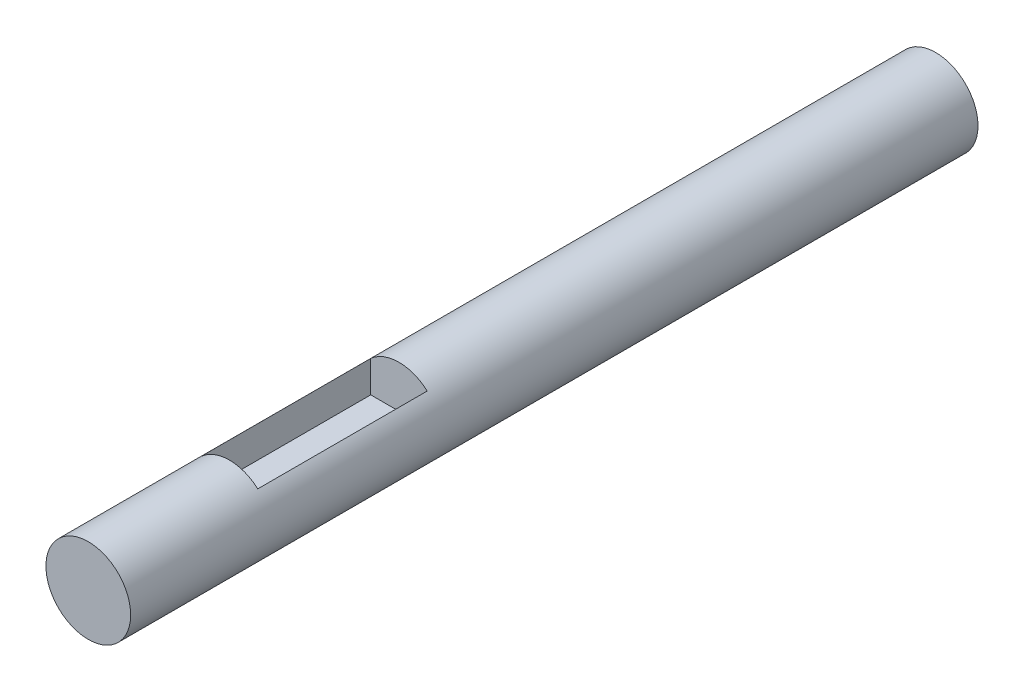
ISO-10303-21;
HEADER;
FILE_DESCRIPTION(('STEP AP214'),'2;1');
FILE_NAME('part.step','',(''),(''),'','','');
FILE_SCHEMA(('AUTOMOTIVE_DESIGN { 1 0 10303 214 1 1 1 1 }'));
ENDSEC;
DATA;
#1=APPLICATION_CONTEXT('core data for automotive mechanical design processes');
#2=APPLICATION_PROTOCOL_DEFINITION('international standard','automotive_design',2000,#1);
#3=PRODUCT_CONTEXT('',#1,'mechanical');
#4=PRODUCT('Part','Part','',(#3));
#5=PRODUCT_RELATED_PRODUCT_CATEGORY('part','',(#4));
#6=PRODUCT_DEFINITION_FORMATION('','',#4);
#7=PRODUCT_DEFINITION_CONTEXT('part definition',#1,'design');
#8=PRODUCT_DEFINITION('design','',#6,#7);
#9=PRODUCT_DEFINITION_SHAPE('','',#8);
#10=(LENGTH_UNIT() NAMED_UNIT(*) SI_UNIT(.MILLI.,.METRE.));
#11=(NAMED_UNIT(*) PLANE_ANGLE_UNIT() SI_UNIT($,.RADIAN.));
#12=(NAMED_UNIT(*) SI_UNIT($,.STERADIAN.) SOLID_ANGLE_UNIT());
#13=UNCERTAINTY_MEASURE_WITH_UNIT(LENGTH_MEASURE(1.E-05),#10,'distance_accuracy_value','');
#14=(GEOMETRIC_REPRESENTATION_CONTEXT(3) GLOBAL_UNCERTAINTY_ASSIGNED_CONTEXT((#13)) GLOBAL_UNIT_ASSIGNED_CONTEXT((#10,
#11,#12)) REPRESENTATION_CONTEXT('',''));
#15=CARTESIAN_POINT('',(0.,0.,0.));
#16=DIRECTION('',(0.,0.,1.));
#17=DIRECTION('',(1.,0.,0.));
#18=AXIS2_PLACEMENT_3D('',#15,#16,#17);
#19=CARTESIAN_POINT('',(0.,0.,60.));
#20=DIRECTION('',(0.,0.,-1.));
#21=DIRECTION('',(-1.,0.,0.));
#22=AXIS2_PLACEMENT_3D('',#19,#20,#21);
#23=CYLINDRICAL_SURFACE('',#22,3.);
#24=DIRECTION('',(0.,0.,-1.));
#25=VECTOR('',#24,1.);
#26=CARTESIAN_POINT('',(-2.,2.23606797749979,60.));
#27=LINE('',#26,#25);
#28=CARTESIAN_POINT('',(-2.,2.23606797749979,50.));
#29=VERTEX_POINT('',#28);
#30=CARTESIAN_POINT('',(-2.,2.23606797749979,38.));
#31=VERTEX_POINT('',#30);
#32=EDGE_CURVE('E11',#29,#31,#27,.T.);
#33=ORIENTED_EDGE('',*,*,#32,.T.);
#34=CARTESIAN_POINT('',(0.,0.,38.));
#35=DIRECTION('',(0.,0.,-1.));
#36=DIRECTION('',(-1.,0.,0.));
#37=AXIS2_PLACEMENT_3D('',#34,#35,#36);
#38=CIRCLE('',#37,3.);
#39=CARTESIAN_POINT('',(2.,2.23606797749979,38.));
#40=VERTEX_POINT('',#39);
#41=EDGE_CURVE('E113',#31,#40,#38,.T.);
#42=ORIENTED_EDGE('',*,*,#41,.T.);
#43=DIRECTION('',(0.,0.,-1.));
#44=VECTOR('',#43,1.);
#45=CARTESIAN_POINT('',(2.,2.23606797749979,60.));
#46=LINE('',#45,#44);
#47=CARTESIAN_POINT('',(2.,2.23606797749979,50.));
#48=VERTEX_POINT('',#47);
#49=EDGE_CURVE('E47',#40,#48,#46,.F.);
#50=ORIENTED_EDGE('',*,*,#49,.T.);
#51=CARTESIAN_POINT('',(0.,0.,50.));
#52=DIRECTION('',(0.,0.,1.));
#53=DIRECTION('',(1.,0.,0.));
#54=AXIS2_PLACEMENT_3D('',#51,#52,#53);
#55=CIRCLE('',#54,3.);
#56=EDGE_CURVE('E62',#48,#29,#55,.T.);
#57=ORIENTED_EDGE('',*,*,#56,.T.);
#58=EDGE_LOOP('',(#33,#42,#50,#57));
#59=FACE_BOUND('',#58,.T.);
#60=CARTESIAN_POINT('',(0.,0.,60.));
#61=DIRECTION('',(0.,0.,1.));
#62=DIRECTION('',(1.,0.,0.));
#63=AXIS2_PLACEMENT_3D('',#60,#61,#62);
#64=CIRCLE('',#63,3.);
#65=CARTESIAN_POINT('',(3.,0.,60.));
#66=VERTEX_POINT('',#65);
#67=EDGE_CURVE('E110',#66,#66,#64,.T.);
#68=ORIENTED_EDGE('',*,*,#67,.F.);
#69=EDGE_LOOP('',(#68));
#70=FACE_BOUND('',#69,.T.);
#71=CARTESIAN_POINT('',(0.,0.,0.));
#72=DIRECTION('',(0.,0.,1.));
#73=DIRECTION('',(1.,0.,0.));
#74=AXIS2_PLACEMENT_3D('',#71,#72,#73);
#75=CIRCLE('',#74,3.);
#76=CARTESIAN_POINT('',(3.,0.,0.));
#77=VERTEX_POINT('',#76);
#78=EDGE_CURVE('E106',#77,#77,#75,.T.);
#79=ORIENTED_EDGE('',*,*,#78,.T.);
#80=EDGE_LOOP('',(#79));
#81=FACE_BOUND('',#80,.T.);
#82=ADVANCED_FACE('F40',(#59,#70,#81),#23,.T.);
#83=CARTESIAN_POINT('',(0.,0.,60.));
#84=DIRECTION('',(0.,0.,1.));
#85=DIRECTION('',(1.,0.,0.));
#86=AXIS2_PLACEMENT_3D('',#83,#84,#85);
#87=PLANE('',#86);
#88=ORIENTED_EDGE('',*,*,#67,.T.);
#89=EDGE_LOOP('',(#88));
#90=FACE_BOUND('',#89,.T.);
#91=ADVANCED_FACE('F133',(#90),#87,.T.);
#92=CARTESIAN_POINT('',(0.,0.,0.));
#93=DIRECTION('',(0.,0.,1.));
#94=DIRECTION('',(1.,0.,0.));
#95=AXIS2_PLACEMENT_3D('',#92,#93,#94);
#96=PLANE('',#95);
#97=ORIENTED_EDGE('',*,*,#78,.F.);
#98=EDGE_LOOP('',(#97));
#99=FACE_BOUND('',#98,.T.);
#100=ADVANCED_FACE('F129',(#99),#96,.F.);
#101=CARTESIAN_POINT('',(2.,0.,50.));
#102=DIRECTION('',(1.,0.,0.));
#103=DIRECTION('',(0.,0.,-1.));
#104=AXIS2_PLACEMENT_3D('',#101,#102,#103);
#105=PLANE('',#104);
#106=DIRECTION('',(0.,1.,0.));
#107=VECTOR('',#106,1.);
#108=CARTESIAN_POINT('',(2.,0.,38.));
#109=LINE('',#108,#107);
#110=CARTESIAN_POINT('',(2.,0.,38.));
#111=VERTEX_POINT('',#110);
#112=EDGE_CURVE('E54',#111,#40,#109,.T.);
#113=ORIENTED_EDGE('',*,*,#112,.F.);
#114=DIRECTION('',(0.,0.,-1.));
#115=VECTOR('',#114,1.);
#116=CARTESIAN_POINT('',(2.,0.,50.));
#117=LINE('',#116,#115);
#118=CARTESIAN_POINT('',(2.,0.,50.));
#119=VERTEX_POINT('',#118);
#120=EDGE_CURVE('E82',#119,#111,#117,.T.);
#121=ORIENTED_EDGE('',*,*,#120,.F.);
#122=DIRECTION('',(0.,1.,0.));
#123=VECTOR('',#122,1.);
#124=CARTESIAN_POINT('',(2.,0.,50.));
#125=LINE('',#124,#123);
#126=EDGE_CURVE('E104',#119,#48,#125,.T.);
#127=ORIENTED_EDGE('',*,*,#126,.T.);
#128=ORIENTED_EDGE('',*,*,#49,.F.);
#129=EDGE_LOOP('',(#113,#121,#127,#128));
#130=FACE_BOUND('',#129,.T.);
#131=ADVANCED_FACE('F80',(#130),#105,.F.);
#132=CARTESIAN_POINT('',(-2.,0.,50.));
#133=DIRECTION('',(0.,0.,1.));
#134=DIRECTION('',(1.,0.,0.));
#135=AXIS2_PLACEMENT_3D('',#132,#133,#134);
#136=PLANE('',#135);
#137=ORIENTED_EDGE('',*,*,#126,.F.);
#138=DIRECTION('',(1.,0.,0.));
#139=VECTOR('',#138,1.);
#140=CARTESIAN_POINT('',(-2.,0.,50.));
#141=LINE('',#140,#139);
#142=CARTESIAN_POINT('',(-2.,0.,50.));
#143=VERTEX_POINT('',#142);
#144=EDGE_CURVE('E87',#143,#119,#141,.T.);
#145=ORIENTED_EDGE('',*,*,#144,.F.);
#146=DIRECTION('',(0.,1.,0.));
#147=VECTOR('',#146,1.);
#148=CARTESIAN_POINT('',(-2.,0.,50.));
#149=LINE('',#148,#147);
#150=EDGE_CURVE('E107',#143,#29,#149,.T.);
#151=ORIENTED_EDGE('',*,*,#150,.T.);
#152=ORIENTED_EDGE('',*,*,#56,.F.);
#153=EDGE_LOOP('',(#137,#145,#151,#152));
#154=FACE_BOUND('',#153,.T.);
#155=ADVANCED_FACE('F121',(#154),#136,.F.);
#156=CARTESIAN_POINT('',(-2.,0.,50.));
#157=DIRECTION('',(-1.,0.,0.));
#158=DIRECTION('',(0.,0.,1.));
#159=AXIS2_PLACEMENT_3D('',#156,#157,#158);
#160=PLANE('',#159);
#161=ORIENTED_EDGE('',*,*,#150,.F.);
#162=DIRECTION('',(0.,0.,1.));
#163=VECTOR('',#162,1.);
#164=CARTESIAN_POINT('',(-2.,0.,50.));
#165=LINE('',#164,#163);
#166=CARTESIAN_POINT('',(-2.,0.,38.));
#167=VERTEX_POINT('',#166);
#168=EDGE_CURVE('E96',#167,#143,#165,.T.);
#169=ORIENTED_EDGE('',*,*,#168,.F.);
#170=DIRECTION('',(0.,1.,0.));
#171=VECTOR('',#170,1.);
#172=CARTESIAN_POINT('',(-2.,0.,38.));
#173=LINE('',#172,#171);
#174=EDGE_CURVE('E86',#167,#31,#173,.T.);
#175=ORIENTED_EDGE('',*,*,#174,.T.);
#176=ORIENTED_EDGE('',*,*,#32,.F.);
#177=EDGE_LOOP('',(#161,#169,#175,#176));
#178=FACE_BOUND('',#177,.T.);
#179=ADVANCED_FACE('F120',(#178),#160,.F.);
#180=CARTESIAN_POINT('',(-2.,0.,38.));
#181=DIRECTION('',(0.,0.,-1.));
#182=DIRECTION('',(-1.,0.,0.));
#183=AXIS2_PLACEMENT_3D('',#180,#181,#182);
#184=PLANE('',#183);
#185=ORIENTED_EDGE('',*,*,#174,.F.);
#186=DIRECTION('',(-1.,0.,0.));
#187=VECTOR('',#186,1.);
#188=CARTESIAN_POINT('',(-2.,0.,38.));
#189=LINE('',#188,#187);
#190=EDGE_CURVE('E90',#111,#167,#189,.T.);
#191=ORIENTED_EDGE('',*,*,#190,.F.);
#192=ORIENTED_EDGE('',*,*,#112,.T.);
#193=ORIENTED_EDGE('',*,*,#41,.F.);
#194=EDGE_LOOP('',(#185,#191,#192,#193));
#195=FACE_BOUND('',#194,.T.);
#196=ADVANCED_FACE('F91',(#195),#184,.F.);
#197=CARTESIAN_POINT('',(0.,0.,0.));
#198=DIRECTION('',(0.,-1.,0.));
#199=DIRECTION('',(0.,0.,-1.));
#200=AXIS2_PLACEMENT_3D('',#197,#198,#199);
#201=PLANE('',#200);
#202=ORIENTED_EDGE('',*,*,#120,.T.);
#203=ORIENTED_EDGE('',*,*,#190,.T.);
#204=ORIENTED_EDGE('',*,*,#168,.T.);
#205=ORIENTED_EDGE('',*,*,#144,.T.);
#206=EDGE_LOOP('',(#202,#203,#204,#205));
#207=FACE_BOUND('',#206,.T.);
#208=ADVANCED_FACE('F98',(#207),#201,.F.);
#209=CLOSED_SHELL('',(#82,#91,#100,#131,#155,#179,#196,#208));
#210=MANIFOLD_SOLID_BREP('B2',#209);
#211=ADVANCED_BREP_SHAPE_REPRESENTATION('',(#18,#210),#14);
#212=SHAPE_DEFINITION_REPRESENTATION(#9,#211);
ENDSEC;
END-ISO-10303-21;
